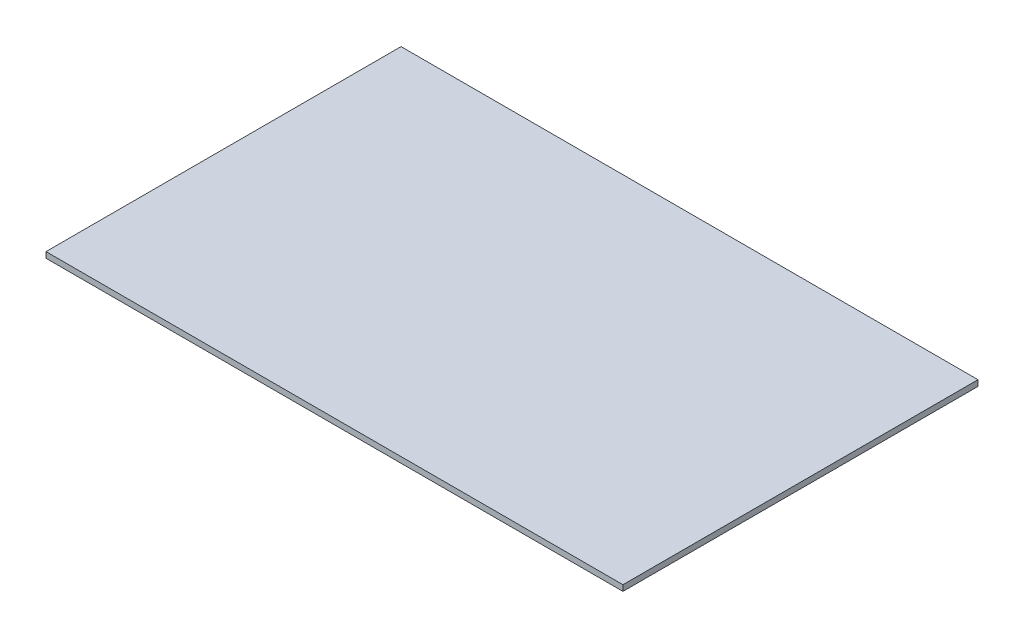
ISO-10303-21;
HEADER;
FILE_DESCRIPTION(('STEP AP214'),'2;1');
FILE_NAME('part.step','',(''),(''),'','','');
FILE_SCHEMA(('AUTOMOTIVE_DESIGN { 1 0 10303 214 1 1 1 1 }'));
ENDSEC;
DATA;
#1=APPLICATION_CONTEXT('core data for automotive mechanical design processes');
#2=APPLICATION_PROTOCOL_DEFINITION('international standard','automotive_design',2000,#1);
#3=PRODUCT_CONTEXT('',#1,'mechanical');
#4=PRODUCT('Part','Part','',(#3));
#5=PRODUCT_RELATED_PRODUCT_CATEGORY('part','',(#4));
#6=PRODUCT_DEFINITION_FORMATION('','',#4);
#7=PRODUCT_DEFINITION_CONTEXT('part definition',#1,'design');
#8=PRODUCT_DEFINITION('design','',#6,#7);
#9=PRODUCT_DEFINITION_SHAPE('','',#8);
#10=(LENGTH_UNIT() NAMED_UNIT(*) SI_UNIT(.MILLI.,.METRE.));
#11=(NAMED_UNIT(*) PLANE_ANGLE_UNIT() SI_UNIT($,.RADIAN.));
#12=(NAMED_UNIT(*) SI_UNIT($,.STERADIAN.) SOLID_ANGLE_UNIT());
#13=UNCERTAINTY_MEASURE_WITH_UNIT(LENGTH_MEASURE(1.E-05),#10,'distance_accuracy_value','');
#14=(GEOMETRIC_REPRESENTATION_CONTEXT(3) GLOBAL_UNCERTAINTY_ASSIGNED_CONTEXT((#13)) GLOBAL_UNIT_ASSIGNED_CONTEXT((#10,
#11,#12)) REPRESENTATION_CONTEXT('',''));
#15=CARTESIAN_POINT('',(0.,0.,0.));
#16=DIRECTION('',(0.,0.,1.));
#17=DIRECTION('',(1.,0.,0.));
#18=AXIS2_PLACEMENT_3D('',#15,#16,#17);
#19=CARTESIAN_POINT('',(-495.3,10.,304.8));
#20=DIRECTION('',(1.,0.,0.));
#21=DIRECTION('',(0.,0.,-1.));
#22=AXIS2_PLACEMENT_3D('',#19,#20,#21);
#23=PLANE('',#22);
#24=DIRECTION('',(0.,0.,1.));
#25=VECTOR('',#24,1.);
#26=CARTESIAN_POINT('',(-495.3,0.,304.8));
#27=LINE('',#26,#25);
#28=CARTESIAN_POINT('',(-495.3,0.,-304.8));
#29=VERTEX_POINT('',#28);
#30=CARTESIAN_POINT('',(-495.3,0.,304.8));
#31=VERTEX_POINT('',#30);
#32=EDGE_CURVE('E96',#29,#31,#27,.T.);
#33=ORIENTED_EDGE('',*,*,#32,.T.);
#34=DIRECTION('',(0.,-1.,0.));
#35=VECTOR('',#34,1.);
#36=CARTESIAN_POINT('',(-495.3,10.,304.8));
#37=LINE('',#36,#35);
#38=CARTESIAN_POINT('',(-495.3,10.,304.8));
#39=VERTEX_POINT('',#38);
#40=EDGE_CURVE('E11',#39,#31,#37,.T.);
#41=ORIENTED_EDGE('',*,*,#40,.F.);
#42=DIRECTION('',(0.,0.,1.));
#43=VECTOR('',#42,1.);
#44=CARTESIAN_POINT('',(-495.3,10.,304.8));
#45=LINE('',#44,#43);
#46=CARTESIAN_POINT('',(-495.3,10.,-304.8));
#47=VERTEX_POINT('',#46);
#48=EDGE_CURVE('E84',#47,#39,#45,.T.);
#49=ORIENTED_EDGE('',*,*,#48,.F.);
#50=DIRECTION('',(0.,-1.,0.));
#51=VECTOR('',#50,1.);
#52=CARTESIAN_POINT('',(-495.3,10.,-304.8));
#53=LINE('',#52,#51);
#54=EDGE_CURVE('E92',#47,#29,#53,.T.);
#55=ORIENTED_EDGE('',*,*,#54,.T.);
#56=EDGE_LOOP('',(#33,#41,#49,#55));
#57=FACE_BOUND('',#56,.T.);
#58=ADVANCED_FACE('F33',(#57),#23,.F.);
#59=CARTESIAN_POINT('',(495.3,10.,304.8));
#60=DIRECTION('',(0.,0.,-1.));
#61=DIRECTION('',(-1.,0.,0.));
#62=AXIS2_PLACEMENT_3D('',#59,#60,#61);
#63=PLANE('',#62);
#64=DIRECTION('',(1.,0.,0.));
#65=VECTOR('',#64,1.);
#66=CARTESIAN_POINT('',(495.3,0.,304.8));
#67=LINE('',#66,#65);
#68=CARTESIAN_POINT('',(495.3,0.,304.8));
#69=VERTEX_POINT('',#68);
#70=EDGE_CURVE('E88',#31,#69,#67,.T.);
#71=ORIENTED_EDGE('',*,*,#70,.T.);
#72=DIRECTION('',(0.,-1.,0.));
#73=VECTOR('',#72,1.);
#74=CARTESIAN_POINT('',(495.3,10.,304.8));
#75=LINE('',#74,#73);
#76=CARTESIAN_POINT('',(495.3,10.,304.8));
#77=VERTEX_POINT('',#76);
#78=EDGE_CURVE('E41',#77,#69,#75,.T.);
#79=ORIENTED_EDGE('',*,*,#78,.F.);
#80=DIRECTION('',(1.,0.,0.));
#81=VECTOR('',#80,1.);
#82=CARTESIAN_POINT('',(495.3,10.,304.8));
#83=LINE('',#82,#81);
#84=EDGE_CURVE('E79',#39,#77,#83,.T.);
#85=ORIENTED_EDGE('',*,*,#84,.F.);
#86=ORIENTED_EDGE('',*,*,#40,.T.);
#87=EDGE_LOOP('',(#71,#79,#85,#86));
#88=FACE_BOUND('',#87,.T.);
#89=ADVANCED_FACE('F87',(#88),#63,.F.);
#90=CARTESIAN_POINT('',(495.3,10.,304.8));
#91=DIRECTION('',(-1.,0.,0.));
#92=DIRECTION('',(0.,0.,1.));
#93=AXIS2_PLACEMENT_3D('',#90,#91,#92);
#94=PLANE('',#93);
#95=DIRECTION('',(0.,0.,-1.));
#96=VECTOR('',#95,1.);
#97=CARTESIAN_POINT('',(495.3,0.,304.8));
#98=LINE('',#97,#96);
#99=CARTESIAN_POINT('',(495.3,0.,-304.8));
#100=VERTEX_POINT('',#99);
#101=EDGE_CURVE('E66',#69,#100,#98,.T.);
#102=ORIENTED_EDGE('',*,*,#101,.T.);
#103=DIRECTION('',(0.,-1.,0.));
#104=VECTOR('',#103,1.);
#105=CARTESIAN_POINT('',(495.3,10.,-304.8));
#106=LINE('',#105,#104);
#107=CARTESIAN_POINT('',(495.3,10.,-304.8));
#108=VERTEX_POINT('',#107);
#109=EDGE_CURVE('E89',#108,#100,#106,.T.);
#110=ORIENTED_EDGE('',*,*,#109,.F.);
#111=DIRECTION('',(0.,0.,-1.));
#112=VECTOR('',#111,1.);
#113=CARTESIAN_POINT('',(495.3,10.,304.8));
#114=LINE('',#113,#112);
#115=EDGE_CURVE('E82',#77,#108,#114,.T.);
#116=ORIENTED_EDGE('',*,*,#115,.F.);
#117=ORIENTED_EDGE('',*,*,#78,.T.);
#118=EDGE_LOOP('',(#102,#110,#116,#117));
#119=FACE_BOUND('',#118,.T.);
#120=ADVANCED_FACE('F90',(#119),#94,.F.);
#121=CARTESIAN_POINT('',(495.3,10.,-304.8));
#122=DIRECTION('',(0.,0.,1.));
#123=DIRECTION('',(1.,0.,0.));
#124=AXIS2_PLACEMENT_3D('',#121,#122,#123);
#125=PLANE('',#124);
#126=DIRECTION('',(-1.,0.,0.));
#127=VECTOR('',#126,1.);
#128=CARTESIAN_POINT('',(495.3,0.,-304.8));
#129=LINE('',#128,#127);
#130=EDGE_CURVE('E72',#100,#29,#129,.T.);
#131=ORIENTED_EDGE('',*,*,#130,.T.);
#132=ORIENTED_EDGE('',*,*,#54,.F.);
#133=DIRECTION('',(-1.,0.,0.));
#134=VECTOR('',#133,1.);
#135=CARTESIAN_POINT('',(495.3,10.,-304.8));
#136=LINE('',#135,#134);
#137=EDGE_CURVE('E49',#108,#47,#136,.T.);
#138=ORIENTED_EDGE('',*,*,#137,.F.);
#139=ORIENTED_EDGE('',*,*,#109,.T.);
#140=EDGE_LOOP('',(#131,#132,#138,#139));
#141=FACE_BOUND('',#140,.T.);
#142=ADVANCED_FACE('F103',(#141),#125,.F.);
#143=CARTESIAN_POINT('',(0.,10.,0.));
#144=DIRECTION('',(0.,1.,0.));
#145=DIRECTION('',(0.,0.,1.));
#146=AXIS2_PLACEMENT_3D('',#143,#144,#145);
#147=PLANE('',#146);
#148=ORIENTED_EDGE('',*,*,#48,.T.);
#149=ORIENTED_EDGE('',*,*,#84,.T.);
#150=ORIENTED_EDGE('',*,*,#115,.T.);
#151=ORIENTED_EDGE('',*,*,#137,.T.);
#152=EDGE_LOOP('',(#148,#149,#150,#151));
#153=FACE_BOUND('',#152,.T.);
#154=ADVANCED_FACE('F80',(#153),#147,.T.);
#155=CARTESIAN_POINT('',(0.,0.,0.));
#156=DIRECTION('',(0.,1.,0.));
#157=DIRECTION('',(0.,0.,1.));
#158=AXIS2_PLACEMENT_3D('',#155,#156,#157);
#159=PLANE('',#158);
#160=ORIENTED_EDGE('',*,*,#32,.F.);
#161=ORIENTED_EDGE('',*,*,#130,.F.);
#162=ORIENTED_EDGE('',*,*,#101,.F.);
#163=ORIENTED_EDGE('',*,*,#70,.F.);
#164=EDGE_LOOP('',(#160,#161,#162,#163));
#165=FACE_BOUND('',#164,.T.);
#166=ADVANCED_FACE('F106',(#165),#159,.F.);
#167=CLOSED_SHELL('',(#58,#89,#120,#142,#154,#166));
#168=MANIFOLD_SOLID_BREP('B2',#167);
#169=ADVANCED_BREP_SHAPE_REPRESENTATION('',(#18,#168),#14);
#170=SHAPE_DEFINITION_REPRESENTATION(#9,#169);
ENDSEC;
END-ISO-10303-21;
